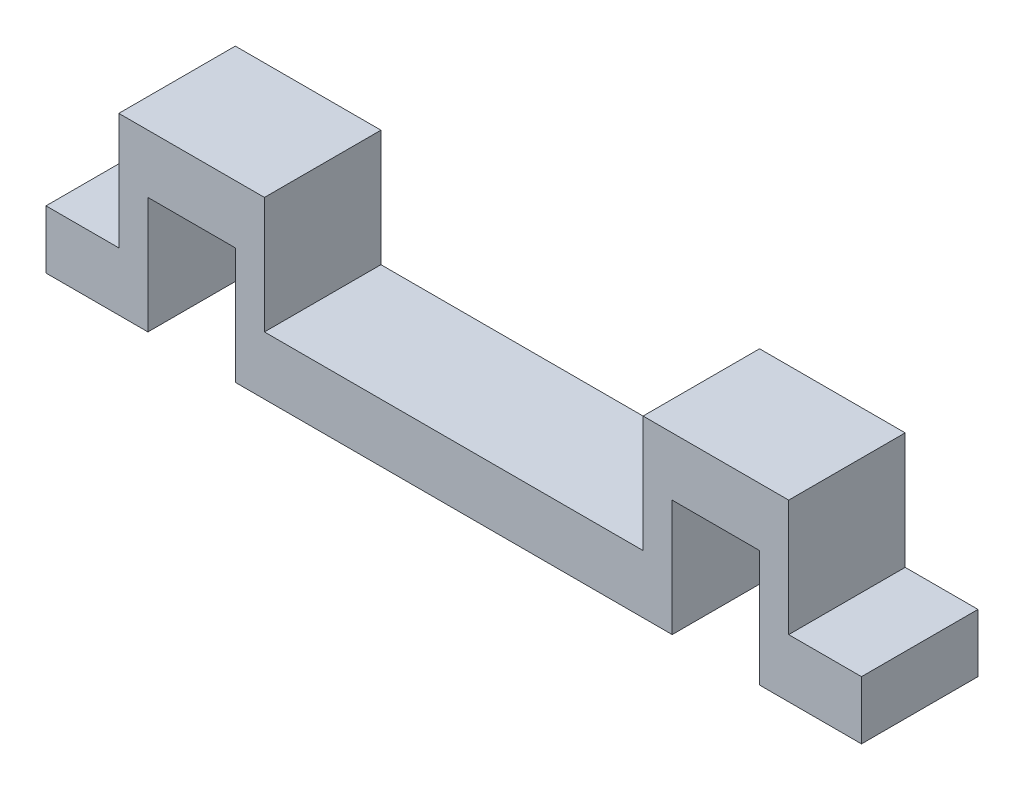
ISO-10303-21;
HEADER;
FILE_DESCRIPTION(('STEP AP214'),'2;1');
FILE_NAME('part.step','',(''),(''),'','','');
FILE_SCHEMA(('AUTOMOTIVE_DESIGN { 1 0 10303 214 1 1 1 1 }'));
ENDSEC;
DATA;
#1=APPLICATION_CONTEXT('core data for automotive mechanical design processes');
#2=APPLICATION_PROTOCOL_DEFINITION('international standard','automotive_design',2000,#1);
#3=PRODUCT_CONTEXT('',#1,'mechanical');
#4=PRODUCT('Part','Part','',(#3));
#5=PRODUCT_RELATED_PRODUCT_CATEGORY('part','',(#4));
#6=PRODUCT_DEFINITION_FORMATION('','',#4);
#7=PRODUCT_DEFINITION_CONTEXT('part definition',#1,'design');
#8=PRODUCT_DEFINITION('design','',#6,#7);
#9=PRODUCT_DEFINITION_SHAPE('','',#8);
#10=(LENGTH_UNIT() NAMED_UNIT(*) SI_UNIT(.MILLI.,.METRE.));
#11=(NAMED_UNIT(*) PLANE_ANGLE_UNIT() SI_UNIT($,.RADIAN.));
#12=(NAMED_UNIT(*) SI_UNIT($,.STERADIAN.) SOLID_ANGLE_UNIT());
#13=UNCERTAINTY_MEASURE_WITH_UNIT(LENGTH_MEASURE(1.E-05),#10,'distance_accuracy_value','');
#14=(GEOMETRIC_REPRESENTATION_CONTEXT(3) GLOBAL_UNCERTAINTY_ASSIGNED_CONTEXT((#13)) GLOBAL_UNIT_ASSIGNED_CONTEXT((#10,
#11,#12)) REPRESENTATION_CONTEXT('',''));
#15=CARTESIAN_POINT('',(0.,0.,0.));
#16=DIRECTION('',(0.,0.,1.));
#17=DIRECTION('',(1.,0.,0.));
#18=AXIS2_PLACEMENT_3D('',#15,#16,#17);
#19=CARTESIAN_POINT('',(37.5,0.,20.));
#20=DIRECTION('',(-1.,0.,0.));
#21=DIRECTION('',(0.,-1.,0.));
#22=AXIS2_PLACEMENT_3D('',#19,#20,#21);
#23=PLANE('',#22);
#24=DIRECTION('',(0.,1.,0.));
#25=VECTOR('',#24,1.);
#26=CARTESIAN_POINT('',(37.5,0.,0.));
#27=LINE('',#26,#25);
#28=CARTESIAN_POINT('',(37.5,0.,0.));
#29=VERTEX_POINT('',#28);
#30=CARTESIAN_POINT('',(37.5,20.,0.));
#31=VERTEX_POINT('',#30);
#32=EDGE_CURVE('E216',#29,#31,#27,.T.);
#33=ORIENTED_EDGE('',*,*,#32,.T.);
#34=DIRECTION('',(0.,0.,-1.));
#35=VECTOR('',#34,1.);
#36=CARTESIAN_POINT('',(37.5,20.,20.));
#37=LINE('',#36,#35);
#38=CARTESIAN_POINT('',(37.5,20.,20.));
#39=VERTEX_POINT('',#38);
#40=EDGE_CURVE('E11',#39,#31,#37,.T.);
#41=ORIENTED_EDGE('',*,*,#40,.F.);
#42=DIRECTION('',(0.,1.,0.));
#43=VECTOR('',#42,1.);
#44=CARTESIAN_POINT('',(37.5,0.,20.));
#45=LINE('',#44,#43);
#46=CARTESIAN_POINT('',(37.5,0.,20.));
#47=VERTEX_POINT('',#46);
#48=EDGE_CURVE('E274',#47,#39,#45,.T.);
#49=ORIENTED_EDGE('',*,*,#48,.F.);
#50=DIRECTION('',(0.,0.,-1.));
#51=VECTOR('',#50,1.);
#52=CARTESIAN_POINT('',(37.5,0.,20.));
#53=LINE('',#52,#51);
#54=EDGE_CURVE('E212',#47,#29,#53,.T.);
#55=ORIENTED_EDGE('',*,*,#54,.T.);
#56=EDGE_LOOP('',(#33,#41,#49,#55));
#57=FACE_BOUND('',#56,.T.);
#58=ADVANCED_FACE('F43',(#57),#23,.F.);
#59=CARTESIAN_POINT('',(37.5,20.,20.));
#60=DIRECTION('',(0.,1.,0.));
#61=DIRECTION('',(-1.,0.,0.));
#62=AXIS2_PLACEMENT_3D('',#59,#60,#61);
#63=PLANE('',#62);
#64=DIRECTION('',(1.,0.,0.));
#65=VECTOR('',#64,1.);
#66=CARTESIAN_POINT('',(37.5,20.,0.));
#67=LINE('',#66,#65);
#68=CARTESIAN_POINT('',(52.5,20.,0.));
#69=VERTEX_POINT('',#68);
#70=EDGE_CURVE('E220',#31,#69,#67,.T.);
#71=ORIENTED_EDGE('',*,*,#70,.T.);
#72=DIRECTION('',(0.,0.,-1.));
#73=VECTOR('',#72,1.);
#74=CARTESIAN_POINT('',(52.5,20.,20.));
#75=LINE('',#74,#73);
#76=CARTESIAN_POINT('',(52.5,20.,20.));
#77=VERTEX_POINT('',#76);
#78=EDGE_CURVE('E52',#77,#69,#75,.T.);
#79=ORIENTED_EDGE('',*,*,#78,.F.);
#80=DIRECTION('',(1.,0.,0.));
#81=VECTOR('',#80,1.);
#82=CARTESIAN_POINT('',(37.5,20.,20.));
#83=LINE('',#82,#81);
#84=EDGE_CURVE('E139',#39,#77,#83,.T.);
#85=ORIENTED_EDGE('',*,*,#84,.F.);
#86=ORIENTED_EDGE('',*,*,#40,.T.);
#87=EDGE_LOOP('',(#71,#79,#85,#86));
#88=FACE_BOUND('',#87,.T.);
#89=ADVANCED_FACE('F424',(#88),#63,.F.);
#90=CARTESIAN_POINT('',(52.5,20.,20.));
#91=DIRECTION('',(1.,0.,0.));
#92=DIRECTION('',(0.,0.,-1.));
#93=AXIS2_PLACEMENT_3D('',#90,#91,#92);
#94=PLANE('',#93);
#95=DIRECTION('',(0.,-1.,0.));
#96=VECTOR('',#95,1.);
#97=CARTESIAN_POINT('',(52.5,20.,0.));
#98=LINE('',#97,#96);
#99=CARTESIAN_POINT('',(52.5,0.,0.));
#100=VERTEX_POINT('',#99);
#101=EDGE_CURVE('E223',#69,#100,#98,.T.);
#102=ORIENTED_EDGE('',*,*,#101,.T.);
#103=DIRECTION('',(0.,0.,-1.));
#104=VECTOR('',#103,1.);
#105=CARTESIAN_POINT('',(52.5,0.,20.));
#106=LINE('',#105,#104);
#107=CARTESIAN_POINT('',(52.5,0.,20.));
#108=VERTEX_POINT('',#107);
#109=EDGE_CURVE('E333',#108,#100,#106,.T.);
#110=ORIENTED_EDGE('',*,*,#109,.F.);
#111=DIRECTION('',(0.,-1.,0.));
#112=VECTOR('',#111,1.);
#113=CARTESIAN_POINT('',(52.5,20.,20.));
#114=LINE('',#113,#112);
#115=EDGE_CURVE('E343',#77,#108,#114,.T.);
#116=ORIENTED_EDGE('',*,*,#115,.F.);
#117=ORIENTED_EDGE('',*,*,#78,.T.);
#118=EDGE_LOOP('',(#102,#110,#116,#117));
#119=FACE_BOUND('',#118,.T.);
#120=ADVANCED_FACE('F341',(#119),#94,.F.);
#121=CARTESIAN_POINT('',(52.5,0.,20.));
#122=DIRECTION('',(0.,1.,0.));
#123=DIRECTION('',(-1.,0.,0.));
#124=AXIS2_PLACEMENT_3D('',#121,#122,#123);
#125=PLANE('',#124);
#126=DIRECTION('',(1.,0.,0.));
#127=VECTOR('',#126,1.);
#128=CARTESIAN_POINT('',(52.5,0.,0.));
#129=LINE('',#128,#127);
#130=CARTESIAN_POINT('',(70.,0.,0.));
#131=VERTEX_POINT('',#130);
#132=EDGE_CURVE('E226',#100,#131,#129,.T.);
#133=ORIENTED_EDGE('',*,*,#132,.T.);
#134=DIRECTION('',(0.,0.,-1.));
#135=VECTOR('',#134,1.);
#136=CARTESIAN_POINT('',(70.,0.,20.));
#137=LINE('',#136,#135);
#138=CARTESIAN_POINT('',(70.,0.,20.));
#139=VERTEX_POINT('',#138);
#140=EDGE_CURVE('E329',#139,#131,#137,.T.);
#141=ORIENTED_EDGE('',*,*,#140,.F.);
#142=DIRECTION('',(1.,0.,0.));
#143=VECTOR('',#142,1.);
#144=CARTESIAN_POINT('',(52.5,0.,20.));
#145=LINE('',#144,#143);
#146=EDGE_CURVE('E362',#108,#139,#145,.T.);
#147=ORIENTED_EDGE('',*,*,#146,.F.);
#148=ORIENTED_EDGE('',*,*,#109,.T.);
#149=EDGE_LOOP('',(#133,#141,#147,#148));
#150=FACE_BOUND('',#149,.T.);
#151=ADVANCED_FACE('F352',(#150),#125,.F.);
#152=CARTESIAN_POINT('',(70.,0.,20.));
#153=DIRECTION('',(-1.,0.,0.));
#154=DIRECTION('',(0.,0.,1.));
#155=AXIS2_PLACEMENT_3D('',#152,#153,#154);
#156=PLANE('',#155);
#157=DIRECTION('',(0.,1.,0.));
#158=VECTOR('',#157,1.);
#159=CARTESIAN_POINT('',(70.,0.,0.));
#160=LINE('',#159,#158);
#161=CARTESIAN_POINT('',(70.,10.,0.));
#162=VERTEX_POINT('',#161);
#163=EDGE_CURVE('E229',#131,#162,#160,.T.);
#164=ORIENTED_EDGE('',*,*,#163,.T.);
#165=DIRECTION('',(0.,0.,-1.));
#166=VECTOR('',#165,1.);
#167=CARTESIAN_POINT('',(70.,10.,20.));
#168=LINE('',#167,#166);
#169=CARTESIAN_POINT('',(70.,10.,20.));
#170=VERTEX_POINT('',#169);
#171=EDGE_CURVE('E325',#170,#162,#168,.T.);
#172=ORIENTED_EDGE('',*,*,#171,.F.);
#173=DIRECTION('',(0.,1.,0.));
#174=VECTOR('',#173,1.);
#175=CARTESIAN_POINT('',(70.,0.,20.));
#176=LINE('',#175,#174);
#177=EDGE_CURVE('E358',#139,#170,#176,.T.);
#178=ORIENTED_EDGE('',*,*,#177,.F.);
#179=ORIENTED_EDGE('',*,*,#140,.T.);
#180=EDGE_LOOP('',(#164,#172,#178,#179));
#181=FACE_BOUND('',#180,.T.);
#182=ADVANCED_FACE('F356',(#181),#156,.F.);
#183=CARTESIAN_POINT('',(70.,10.,20.));
#184=DIRECTION('',(0.,-1.,0.));
#185=DIRECTION('',(1.,0.,0.));
#186=AXIS2_PLACEMENT_3D('',#183,#184,#185);
#187=PLANE('',#186);
#188=DIRECTION('',(-1.,0.,0.));
#189=VECTOR('',#188,1.);
#190=CARTESIAN_POINT('',(70.,10.,0.));
#191=LINE('',#190,#189);
#192=CARTESIAN_POINT('',(57.5,10.,0.));
#193=VERTEX_POINT('',#192);
#194=EDGE_CURVE('E232',#162,#193,#191,.T.);
#195=ORIENTED_EDGE('',*,*,#194,.T.);
#196=DIRECTION('',(0.,0.,-1.));
#197=VECTOR('',#196,1.);
#198=CARTESIAN_POINT('',(57.5,10.,20.));
#199=LINE('',#198,#197);
#200=CARTESIAN_POINT('',(57.5,10.,20.));
#201=VERTEX_POINT('',#200);
#202=EDGE_CURVE('E321',#201,#193,#199,.T.);
#203=ORIENTED_EDGE('',*,*,#202,.F.);
#204=DIRECTION('',(-1.,0.,0.));
#205=VECTOR('',#204,1.);
#206=CARTESIAN_POINT('',(70.,10.,20.));
#207=LINE('',#206,#205);
#208=EDGE_CURVE('E361',#170,#201,#207,.T.);
#209=ORIENTED_EDGE('',*,*,#208,.F.);
#210=ORIENTED_EDGE('',*,*,#171,.T.);
#211=EDGE_LOOP('',(#195,#203,#209,#210));
#212=FACE_BOUND('',#211,.T.);
#213=ADVANCED_FACE('F437',(#212),#187,.F.);
#214=CARTESIAN_POINT('',(57.5,10.,20.));
#215=DIRECTION('',(-1.,0.,0.));
#216=DIRECTION('',(0.,0.,1.));
#217=AXIS2_PLACEMENT_3D('',#214,#215,#216);
#218=PLANE('',#217);
#219=DIRECTION('',(0.,1.,0.));
#220=VECTOR('',#219,1.);
#221=CARTESIAN_POINT('',(57.5,10.,0.));
#222=LINE('',#221,#220);
#223=CARTESIAN_POINT('',(57.5,30.,0.));
#224=VERTEX_POINT('',#223);
#225=EDGE_CURVE('E235',#193,#224,#222,.T.);
#226=ORIENTED_EDGE('',*,*,#225,.T.);
#227=DIRECTION('',(0.,0.,-1.));
#228=VECTOR('',#227,1.);
#229=CARTESIAN_POINT('',(57.5,30.,20.));
#230=LINE('',#229,#228);
#231=CARTESIAN_POINT('',(57.5,30.,20.));
#232=VERTEX_POINT('',#231);
#233=EDGE_CURVE('E317',#232,#224,#230,.T.);
#234=ORIENTED_EDGE('',*,*,#233,.F.);
#235=DIRECTION('',(0.,1.,0.));
#236=VECTOR('',#235,1.);
#237=CARTESIAN_POINT('',(57.5,10.,20.));
#238=LINE('',#237,#236);
#239=EDGE_CURVE('E366',#201,#232,#238,.T.);
#240=ORIENTED_EDGE('',*,*,#239,.F.);
#241=ORIENTED_EDGE('',*,*,#202,.T.);
#242=EDGE_LOOP('',(#226,#234,#240,#241));
#243=FACE_BOUND('',#242,.T.);
#244=ADVANCED_FACE('F440',(#243),#218,.F.);
#245=CARTESIAN_POINT('',(57.5,30.,20.));
#246=DIRECTION('',(0.,-1.,0.));
#247=DIRECTION('',(1.,0.,0.));
#248=AXIS2_PLACEMENT_3D('',#245,#246,#247);
#249=PLANE('',#248);
#250=DIRECTION('',(-1.,0.,0.));
#251=VECTOR('',#250,1.);
#252=CARTESIAN_POINT('',(57.5,30.,0.));
#253=LINE('',#252,#251);
#254=CARTESIAN_POINT('',(32.5,30.,0.));
#255=VERTEX_POINT('',#254);
#256=EDGE_CURVE('E238',#224,#255,#253,.T.);
#257=ORIENTED_EDGE('',*,*,#256,.T.);
#258=DIRECTION('',(0.,0.,-1.));
#259=VECTOR('',#258,1.);
#260=CARTESIAN_POINT('',(32.5,30.,20.));
#261=LINE('',#260,#259);
#262=CARTESIAN_POINT('',(32.5,30.,20.));
#263=VERTEX_POINT('',#262);
#264=EDGE_CURVE('E313',#263,#255,#261,.T.);
#265=ORIENTED_EDGE('',*,*,#264,.F.);
#266=DIRECTION('',(-1.,0.,0.));
#267=VECTOR('',#266,1.);
#268=CARTESIAN_POINT('',(57.5,30.,20.));
#269=LINE('',#268,#267);
#270=EDGE_CURVE('E373',#232,#263,#269,.T.);
#271=ORIENTED_EDGE('',*,*,#270,.F.);
#272=ORIENTED_EDGE('',*,*,#233,.T.);
#273=EDGE_LOOP('',(#257,#265,#271,#272));
#274=FACE_BOUND('',#273,.T.);
#275=ADVANCED_FACE('F444',(#274),#249,.F.);
#276=CARTESIAN_POINT('',(32.5,30.,20.));
#277=DIRECTION('',(1.,0.,0.));
#278=DIRECTION('',(0.,0.,-1.));
#279=AXIS2_PLACEMENT_3D('',#276,#277,#278);
#280=PLANE('',#279);
#281=DIRECTION('',(0.,-1.,0.));
#282=VECTOR('',#281,1.);
#283=CARTESIAN_POINT('',(32.5,30.,0.));
#284=LINE('',#283,#282);
#285=CARTESIAN_POINT('',(32.5,10.,0.));
#286=VERTEX_POINT('',#285);
#287=EDGE_CURVE('E241',#255,#286,#284,.T.);
#288=ORIENTED_EDGE('',*,*,#287,.T.);
#289=DIRECTION('',(0.,0.,-1.));
#290=VECTOR('',#289,1.);
#291=CARTESIAN_POINT('',(32.5,10.,20.));
#292=LINE('',#291,#290);
#293=CARTESIAN_POINT('',(32.5,10.,20.));
#294=VERTEX_POINT('',#293);
#295=EDGE_CURVE('E309',#294,#286,#292,.T.);
#296=ORIENTED_EDGE('',*,*,#295,.F.);
#297=DIRECTION('',(0.,-1.,0.));
#298=VECTOR('',#297,1.);
#299=CARTESIAN_POINT('',(32.5,30.,20.));
#300=LINE('',#299,#298);
#301=EDGE_CURVE('E376',#263,#294,#300,.T.);
#302=ORIENTED_EDGE('',*,*,#301,.F.);
#303=ORIENTED_EDGE('',*,*,#264,.T.);
#304=EDGE_LOOP('',(#288,#296,#302,#303));
#305=FACE_BOUND('',#304,.T.);
#306=ADVANCED_FACE('F448',(#305),#280,.F.);
#307=CARTESIAN_POINT('',(-32.5,9.99999999999999,20.));
#308=DIRECTION('',(0.,-1.,0.));
#309=DIRECTION('',(1.,0.,0.));
#310=AXIS2_PLACEMENT_3D('',#307,#308,#309);
#311=PLANE('',#310);
#312=DIRECTION('',(-1.,0.,0.));
#313=VECTOR('',#312,1.);
#314=CARTESIAN_POINT('',(-32.5,9.99999999999999,0.));
#315=LINE('',#314,#313);
#316=CARTESIAN_POINT('',(-32.5,9.99999999999999,0.));
#317=VERTEX_POINT('',#316);
#318=EDGE_CURVE('E244',#286,#317,#315,.T.);
#319=ORIENTED_EDGE('',*,*,#318,.T.);
#320=DIRECTION('',(0.,0.,-1.));
#321=VECTOR('',#320,1.);
#322=CARTESIAN_POINT('',(-32.5,9.99999999999999,20.));
#323=LINE('',#322,#321);
#324=CARTESIAN_POINT('',(-32.5,9.99999999999999,20.));
#325=VERTEX_POINT('',#324);
#326=EDGE_CURVE('E305',#325,#317,#323,.T.);
#327=ORIENTED_EDGE('',*,*,#326,.F.);
#328=DIRECTION('',(-1.,0.,0.));
#329=VECTOR('',#328,1.);
#330=CARTESIAN_POINT('',(-32.5,9.99999999999999,20.));
#331=LINE('',#330,#329);
#332=EDGE_CURVE('E379',#294,#325,#331,.T.);
#333=ORIENTED_EDGE('',*,*,#332,.F.);
#334=ORIENTED_EDGE('',*,*,#295,.T.);
#335=EDGE_LOOP('',(#319,#327,#333,#334));
#336=FACE_BOUND('',#335,.T.);
#337=ADVANCED_FACE('F452',(#336),#311,.F.);
#338=CARTESIAN_POINT('',(-32.5,30.,20.));
#339=DIRECTION('',(-1.,0.,0.));
#340=DIRECTION('',(0.,0.,1.));
#341=AXIS2_PLACEMENT_3D('',#338,#339,#340);
#342=PLANE('',#341);
#343=DIRECTION('',(0.,1.,0.));
#344=VECTOR('',#343,1.);
#345=CARTESIAN_POINT('',(-32.5,30.,0.));
#346=LINE('',#345,#344);
#347=CARTESIAN_POINT('',(-32.5,30.,0.));
#348=VERTEX_POINT('',#347);
#349=EDGE_CURVE('E247',#317,#348,#346,.T.);
#350=ORIENTED_EDGE('',*,*,#349,.T.);
#351=DIRECTION('',(0.,0.,-1.));
#352=VECTOR('',#351,1.);
#353=CARTESIAN_POINT('',(-32.5,30.,20.));
#354=LINE('',#353,#352);
#355=CARTESIAN_POINT('',(-32.5,30.,20.));
#356=VERTEX_POINT('',#355);
#357=EDGE_CURVE('E301',#356,#348,#354,.T.);
#358=ORIENTED_EDGE('',*,*,#357,.F.);
#359=DIRECTION('',(0.,1.,0.));
#360=VECTOR('',#359,1.);
#361=CARTESIAN_POINT('',(-32.5,30.,20.));
#362=LINE('',#361,#360);
#363=EDGE_CURVE('E382',#325,#356,#362,.T.);
#364=ORIENTED_EDGE('',*,*,#363,.F.);
#365=ORIENTED_EDGE('',*,*,#326,.T.);
#366=EDGE_LOOP('',(#350,#358,#364,#365));
#367=FACE_BOUND('',#366,.T.);
#368=ADVANCED_FACE('F456',(#367),#342,.F.);
#369=CARTESIAN_POINT('',(-57.5,30.,20.));
#370=DIRECTION('',(0.,-1.,0.));
#371=DIRECTION('',(1.,0.,0.));
#372=AXIS2_PLACEMENT_3D('',#369,#370,#371);
#373=PLANE('',#372);
#374=DIRECTION('',(-1.,0.,0.));
#375=VECTOR('',#374,1.);
#376=CARTESIAN_POINT('',(-57.5,30.,0.));
#377=LINE('',#376,#375);
#378=CARTESIAN_POINT('',(-57.5,30.,0.));
#379=VERTEX_POINT('',#378);
#380=EDGE_CURVE('E250',#348,#379,#377,.T.);
#381=ORIENTED_EDGE('',*,*,#380,.T.);
#382=DIRECTION('',(0.,0.,-1.));
#383=VECTOR('',#382,1.);
#384=CARTESIAN_POINT('',(-57.5,30.,20.));
#385=LINE('',#384,#383);
#386=CARTESIAN_POINT('',(-57.5,30.,20.));
#387=VERTEX_POINT('',#386);
#388=EDGE_CURVE('E297',#387,#379,#385,.T.);
#389=ORIENTED_EDGE('',*,*,#388,.F.);
#390=DIRECTION('',(-1.,0.,0.));
#391=VECTOR('',#390,1.);
#392=CARTESIAN_POINT('',(-57.5,30.,20.));
#393=LINE('',#392,#391);
#394=EDGE_CURVE('E385',#356,#387,#393,.T.);
#395=ORIENTED_EDGE('',*,*,#394,.F.);
#396=ORIENTED_EDGE('',*,*,#357,.T.);
#397=EDGE_LOOP('',(#381,#389,#395,#396));
#398=FACE_BOUND('',#397,.T.);
#399=ADVANCED_FACE('F460',(#398),#373,.F.);
#400=CARTESIAN_POINT('',(-57.5,9.99999999999998,20.));
#401=DIRECTION('',(1.,0.,0.));
#402=DIRECTION('',(0.,0.,-1.));
#403=AXIS2_PLACEMENT_3D('',#400,#401,#402);
#404=PLANE('',#403);
#405=DIRECTION('',(0.,-1.,0.));
#406=VECTOR('',#405,1.);
#407=CARTESIAN_POINT('',(-57.5,9.99999999999998,0.));
#408=LINE('',#407,#406);
#409=CARTESIAN_POINT('',(-57.5,9.99999999999998,0.));
#410=VERTEX_POINT('',#409);
#411=EDGE_CURVE('E253',#379,#410,#408,.T.);
#412=ORIENTED_EDGE('',*,*,#411,.T.);
#413=DIRECTION('',(0.,0.,-1.));
#414=VECTOR('',#413,1.);
#415=CARTESIAN_POINT('',(-57.5,9.99999999999998,20.));
#416=LINE('',#415,#414);
#417=CARTESIAN_POINT('',(-57.5,9.99999999999998,20.));
#418=VERTEX_POINT('',#417);
#419=EDGE_CURVE('E293',#418,#410,#416,.T.);
#420=ORIENTED_EDGE('',*,*,#419,.F.);
#421=DIRECTION('',(0.,-1.,0.));
#422=VECTOR('',#421,1.);
#423=CARTESIAN_POINT('',(-57.5,9.99999999999998,20.));
#424=LINE('',#423,#422);
#425=EDGE_CURVE('E388',#387,#418,#424,.T.);
#426=ORIENTED_EDGE('',*,*,#425,.F.);
#427=ORIENTED_EDGE('',*,*,#388,.T.);
#428=EDGE_LOOP('',(#412,#420,#426,#427));
#429=FACE_BOUND('',#428,.T.);
#430=ADVANCED_FACE('F464',(#429),#404,.F.);
#431=CARTESIAN_POINT('',(-70.,9.99999999999998,20.));
#432=DIRECTION('',(0.,-1.,0.));
#433=DIRECTION('',(1.,0.,0.));
#434=AXIS2_PLACEMENT_3D('',#431,#432,#433);
#435=PLANE('',#434);
#436=DIRECTION('',(-1.,0.,0.));
#437=VECTOR('',#436,1.);
#438=CARTESIAN_POINT('',(-70.,9.99999999999998,0.));
#439=LINE('',#438,#437);
#440=CARTESIAN_POINT('',(-70.,9.99999999999998,0.));
#441=VERTEX_POINT('',#440);
#442=EDGE_CURVE('E256',#410,#441,#439,.T.);
#443=ORIENTED_EDGE('',*,*,#442,.T.);
#444=DIRECTION('',(0.,0.,-1.));
#445=VECTOR('',#444,1.);
#446=CARTESIAN_POINT('',(-70.,9.99999999999998,20.));
#447=LINE('',#446,#445);
#448=CARTESIAN_POINT('',(-70.,9.99999999999998,20.));
#449=VERTEX_POINT('',#448);
#450=EDGE_CURVE('E289',#449,#441,#447,.T.);
#451=ORIENTED_EDGE('',*,*,#450,.F.);
#452=DIRECTION('',(-1.,0.,0.));
#453=VECTOR('',#452,1.);
#454=CARTESIAN_POINT('',(-70.,9.99999999999998,20.));
#455=LINE('',#454,#453);
#456=EDGE_CURVE('E391',#418,#449,#455,.T.);
#457=ORIENTED_EDGE('',*,*,#456,.F.);
#458=ORIENTED_EDGE('',*,*,#419,.T.);
#459=EDGE_LOOP('',(#443,#451,#457,#458));
#460=FACE_BOUND('',#459,.T.);
#461=ADVANCED_FACE('F468',(#460),#435,.F.);
#462=CARTESIAN_POINT('',(-70.,0.,20.));
#463=DIRECTION('',(1.,0.,0.));
#464=DIRECTION('',(0.,0.,-1.));
#465=AXIS2_PLACEMENT_3D('',#462,#463,#464);
#466=PLANE('',#465);
#467=DIRECTION('',(0.,-1.,0.));
#468=VECTOR('',#467,1.);
#469=CARTESIAN_POINT('',(-70.,0.,0.));
#470=LINE('',#469,#468);
#471=CARTESIAN_POINT('',(-70.,0.,0.));
#472=VERTEX_POINT('',#471);
#473=EDGE_CURVE('E259',#441,#472,#470,.T.);
#474=ORIENTED_EDGE('',*,*,#473,.T.);
#475=DIRECTION('',(0.,0.,-1.));
#476=VECTOR('',#475,1.);
#477=CARTESIAN_POINT('',(-70.,0.,20.));
#478=LINE('',#477,#476);
#479=CARTESIAN_POINT('',(-70.,0.,20.));
#480=VERTEX_POINT('',#479);
#481=EDGE_CURVE('E285',#480,#472,#478,.T.);
#482=ORIENTED_EDGE('',*,*,#481,.F.);
#483=DIRECTION('',(0.,-1.,0.));
#484=VECTOR('',#483,1.);
#485=CARTESIAN_POINT('',(-70.,0.,20.));
#486=LINE('',#485,#484);
#487=EDGE_CURVE('E394',#449,#480,#486,.T.);
#488=ORIENTED_EDGE('',*,*,#487,.F.);
#489=ORIENTED_EDGE('',*,*,#450,.T.);
#490=EDGE_LOOP('',(#474,#482,#488,#489));
#491=FACE_BOUND('',#490,.T.);
#492=ADVANCED_FACE('F472',(#491),#466,.F.);
#493=CARTESIAN_POINT('',(-52.5,0.,20.));
#494=DIRECTION('',(0.,1.,0.));
#495=DIRECTION('',(-1.,0.,0.));
#496=AXIS2_PLACEMENT_3D('',#493,#494,#495);
#497=PLANE('',#496);
#498=DIRECTION('',(1.,0.,0.));
#499=VECTOR('',#498,1.);
#500=CARTESIAN_POINT('',(-52.5,0.,0.));
#501=LINE('',#500,#499);
#502=CARTESIAN_POINT('',(-52.5,0.,0.));
#503=VERTEX_POINT('',#502);
#504=EDGE_CURVE('E262',#472,#503,#501,.T.);
#505=ORIENTED_EDGE('',*,*,#504,.T.);
#506=DIRECTION('',(0.,0.,-1.));
#507=VECTOR('',#506,1.);
#508=CARTESIAN_POINT('',(-52.5,0.,20.));
#509=LINE('',#508,#507);
#510=CARTESIAN_POINT('',(-52.5,0.,20.));
#511=VERTEX_POINT('',#510);
#512=EDGE_CURVE('E281',#511,#503,#509,.T.);
#513=ORIENTED_EDGE('',*,*,#512,.F.);
#514=DIRECTION('',(1.,0.,0.));
#515=VECTOR('',#514,1.);
#516=CARTESIAN_POINT('',(-52.5,0.,20.));
#517=LINE('',#516,#515);
#518=EDGE_CURVE('E397',#480,#511,#517,.T.);
#519=ORIENTED_EDGE('',*,*,#518,.F.);
#520=ORIENTED_EDGE('',*,*,#481,.T.);
#521=EDGE_LOOP('',(#505,#513,#519,#520));
#522=FACE_BOUND('',#521,.T.);
#523=ADVANCED_FACE('F405',(#522),#497,.F.);
#524=CARTESIAN_POINT('',(-52.5,20.,20.));
#525=DIRECTION('',(-1.,0.,0.));
#526=DIRECTION('',(0.,0.,1.));
#527=AXIS2_PLACEMENT_3D('',#524,#525,#526);
#528=PLANE('',#527);
#529=DIRECTION('',(0.,1.,0.));
#530=VECTOR('',#529,1.);
#531=CARTESIAN_POINT('',(-52.5,20.,0.));
#532=LINE('',#531,#530);
#533=CARTESIAN_POINT('',(-52.5,20.,0.));
#534=VERTEX_POINT('',#533);
#535=EDGE_CURVE('E265',#503,#534,#532,.T.);
#536=ORIENTED_EDGE('',*,*,#535,.T.);
#537=DIRECTION('',(0.,0.,-1.));
#538=VECTOR('',#537,1.);
#539=CARTESIAN_POINT('',(-52.5,20.,20.));
#540=LINE('',#539,#538);
#541=CARTESIAN_POINT('',(-52.5,20.,20.));
#542=VERTEX_POINT('',#541);
#543=EDGE_CURVE('E205',#542,#534,#540,.T.);
#544=ORIENTED_EDGE('',*,*,#543,.F.);
#545=DIRECTION('',(0.,1.,0.));
#546=VECTOR('',#545,1.);
#547=CARTESIAN_POINT('',(-52.5,20.,20.));
#548=LINE('',#547,#546);
#549=EDGE_CURVE('E194',#511,#542,#548,.T.);
#550=ORIENTED_EDGE('',*,*,#549,.F.);
#551=ORIENTED_EDGE('',*,*,#512,.T.);
#552=EDGE_LOOP('',(#536,#544,#550,#551));
#553=FACE_BOUND('',#552,.T.);
#554=ADVANCED_FACE('F409',(#553),#528,.F.);
#555=CARTESIAN_POINT('',(-37.5,20.,20.));
#556=DIRECTION('',(0.,1.,0.));
#557=DIRECTION('',(-1.,0.,0.));
#558=AXIS2_PLACEMENT_3D('',#555,#556,#557);
#559=PLANE('',#558);
#560=DIRECTION('',(1.,0.,0.));
#561=VECTOR('',#560,1.);
#562=CARTESIAN_POINT('',(-37.5,20.,0.));
#563=LINE('',#562,#561);
#564=CARTESIAN_POINT('',(-37.5,20.,0.));
#565=VERTEX_POINT('',#564);
#566=EDGE_CURVE('E203',#534,#565,#563,.T.);
#567=ORIENTED_EDGE('',*,*,#566,.T.);
#568=DIRECTION('',(0.,0.,-1.));
#569=VECTOR('',#568,1.);
#570=CARTESIAN_POINT('',(-37.5,20.,20.));
#571=LINE('',#570,#569);
#572=CARTESIAN_POINT('',(-37.5,20.,20.));
#573=VERTEX_POINT('',#572);
#574=EDGE_CURVE('E200',#573,#565,#571,.T.);
#575=ORIENTED_EDGE('',*,*,#574,.F.);
#576=DIRECTION('',(1.,0.,0.));
#577=VECTOR('',#576,1.);
#578=CARTESIAN_POINT('',(-37.5,20.,20.));
#579=LINE('',#578,#577);
#580=EDGE_CURVE('E188',#542,#573,#579,.T.);
#581=ORIENTED_EDGE('',*,*,#580,.F.);
#582=ORIENTED_EDGE('',*,*,#543,.T.);
#583=EDGE_LOOP('',(#567,#575,#581,#582));
#584=FACE_BOUND('',#583,.T.);
#585=ADVANCED_FACE('F201',(#584),#559,.F.);
#586=CARTESIAN_POINT('',(-37.5,0.,20.));
#587=DIRECTION('',(1.,0.,0.));
#588=DIRECTION('',(0.,0.,-1.));
#589=AXIS2_PLACEMENT_3D('',#586,#587,#588);
#590=PLANE('',#589);
#591=DIRECTION('',(0.,-1.,0.));
#592=VECTOR('',#591,1.);
#593=CARTESIAN_POINT('',(-37.5,0.,0.));
#594=LINE('',#593,#592);
#595=CARTESIAN_POINT('',(-37.5,0.,0.));
#596=VERTEX_POINT('',#595);
#597=EDGE_CURVE('E125',#565,#596,#594,.T.);
#598=ORIENTED_EDGE('',*,*,#597,.T.);
#599=DIRECTION('',(0.,0.,-1.));
#600=VECTOR('',#599,1.);
#601=CARTESIAN_POINT('',(-37.5,0.,20.));
#602=LINE('',#601,#600);
#603=CARTESIAN_POINT('',(-37.5,0.,20.));
#604=VERTEX_POINT('',#603);
#605=EDGE_CURVE('E206',#604,#596,#602,.T.);
#606=ORIENTED_EDGE('',*,*,#605,.F.);
#607=DIRECTION('',(0.,-1.,0.));
#608=VECTOR('',#607,1.);
#609=CARTESIAN_POINT('',(-37.5,0.,20.));
#610=LINE('',#609,#608);
#611=EDGE_CURVE('E192',#573,#604,#610,.T.);
#612=ORIENTED_EDGE('',*,*,#611,.F.);
#613=ORIENTED_EDGE('',*,*,#574,.T.);
#614=EDGE_LOOP('',(#598,#606,#612,#613));
#615=FACE_BOUND('',#614,.T.);
#616=ADVANCED_FACE('F208',(#615),#590,.F.);
#617=CARTESIAN_POINT('',(-37.5,0.,20.));
#618=DIRECTION('',(0.,1.,0.));
#619=DIRECTION('',(-1.,0.,0.));
#620=AXIS2_PLACEMENT_3D('',#617,#618,#619);
#621=PLANE('',#620);
#622=DIRECTION('',(1.,0.,0.));
#623=VECTOR('',#622,1.);
#624=CARTESIAN_POINT('',(-37.5,0.,0.));
#625=LINE('',#624,#623);
#626=EDGE_CURVE('E131',#596,#29,#625,.T.);
#627=ORIENTED_EDGE('',*,*,#626,.T.);
#628=ORIENTED_EDGE('',*,*,#54,.F.);
#629=DIRECTION('',(1.,0.,0.));
#630=VECTOR('',#629,1.);
#631=CARTESIAN_POINT('',(-37.5,0.,20.));
#632=LINE('',#631,#630);
#633=EDGE_CURVE('E60',#604,#47,#632,.T.);
#634=ORIENTED_EDGE('',*,*,#633,.F.);
#635=ORIENTED_EDGE('',*,*,#605,.T.);
#636=EDGE_LOOP('',(#627,#628,#634,#635));
#637=FACE_BOUND('',#636,.T.);
#638=ADVANCED_FACE('F413',(#637),#621,.F.);
#639=CARTESIAN_POINT('',(0.,0.,20.));
#640=DIRECTION('',(0.,0.,-1.));
#641=DIRECTION('',(-1.,0.,0.));
#642=AXIS2_PLACEMENT_3D('',#639,#640,#641);
#643=PLANE('',#642);
#644=ORIENTED_EDGE('',*,*,#48,.T.);
#645=ORIENTED_EDGE('',*,*,#84,.T.);
#646=ORIENTED_EDGE('',*,*,#115,.T.);
#647=ORIENTED_EDGE('',*,*,#146,.T.);
#648=ORIENTED_EDGE('',*,*,#177,.T.);
#649=ORIENTED_EDGE('',*,*,#208,.T.);
#650=ORIENTED_EDGE('',*,*,#239,.T.);
#651=ORIENTED_EDGE('',*,*,#270,.T.);
#652=ORIENTED_EDGE('',*,*,#301,.T.);
#653=ORIENTED_EDGE('',*,*,#332,.T.);
#654=ORIENTED_EDGE('',*,*,#363,.T.);
#655=ORIENTED_EDGE('',*,*,#394,.T.);
#656=ORIENTED_EDGE('',*,*,#425,.T.);
#657=ORIENTED_EDGE('',*,*,#456,.T.);
#658=ORIENTED_EDGE('',*,*,#487,.T.);
#659=ORIENTED_EDGE('',*,*,#518,.T.);
#660=ORIENTED_EDGE('',*,*,#549,.T.);
#661=ORIENTED_EDGE('',*,*,#580,.T.);
#662=ORIENTED_EDGE('',*,*,#611,.T.);
#663=ORIENTED_EDGE('',*,*,#633,.T.);
#664=EDGE_LOOP('',(#644,#645,#646,#647,#648,#649,#650,#651,#652,#653,#654,#655,#656,#657,#658,
#659,#660,#661,#662,#663));
#665=FACE_BOUND('',#664,.T.);
#666=ADVANCED_FACE('F190',(#665),#643,.F.);
#667=CARTESIAN_POINT('',(0.,0.,0.));
#668=DIRECTION('',(0.,0.,-1.));
#669=DIRECTION('',(-1.,0.,0.));
#670=AXIS2_PLACEMENT_3D('',#667,#668,#669);
#671=PLANE('',#670);
#672=ORIENTED_EDGE('',*,*,#32,.F.);
#673=ORIENTED_EDGE('',*,*,#626,.F.);
#674=ORIENTED_EDGE('',*,*,#597,.F.);
#675=ORIENTED_EDGE('',*,*,#566,.F.);
#676=ORIENTED_EDGE('',*,*,#535,.F.);
#677=ORIENTED_EDGE('',*,*,#504,.F.);
#678=ORIENTED_EDGE('',*,*,#473,.F.);
#679=ORIENTED_EDGE('',*,*,#442,.F.);
#680=ORIENTED_EDGE('',*,*,#411,.F.);
#681=ORIENTED_EDGE('',*,*,#380,.F.);
#682=ORIENTED_EDGE('',*,*,#349,.F.);
#683=ORIENTED_EDGE('',*,*,#318,.F.);
#684=ORIENTED_EDGE('',*,*,#287,.F.);
#685=ORIENTED_EDGE('',*,*,#256,.F.);
#686=ORIENTED_EDGE('',*,*,#225,.F.);
#687=ORIENTED_EDGE('',*,*,#194,.F.);
#688=ORIENTED_EDGE('',*,*,#163,.F.);
#689=ORIENTED_EDGE('',*,*,#132,.F.);
#690=ORIENTED_EDGE('',*,*,#101,.F.);
#691=ORIENTED_EDGE('',*,*,#70,.F.);
#692=EDGE_LOOP('',(#672,#673,#674,#675,#676,#677,#678,#679,#680,#681,#682,#683,#684,#685,#686,
#687,#688,#689,#690,#691));
#693=FACE_BOUND('',#692,.T.);
#694=ADVANCED_FACE('F347',(#693),#671,.T.);
#695=CLOSED_SHELL('',(#58,#89,#120,#151,#182,#213,#244,#275,#306,#337,#368,#399,#430,#461,#492,
#523,#554,#585,#616,#638,#666,#694));
#696=MANIFOLD_SOLID_BREP('B2',#695);
#697=ADVANCED_BREP_SHAPE_REPRESENTATION('',(#18,#696),#14);
#698=SHAPE_DEFINITION_REPRESENTATION(#9,#697);
ENDSEC;
END-ISO-10303-21;
